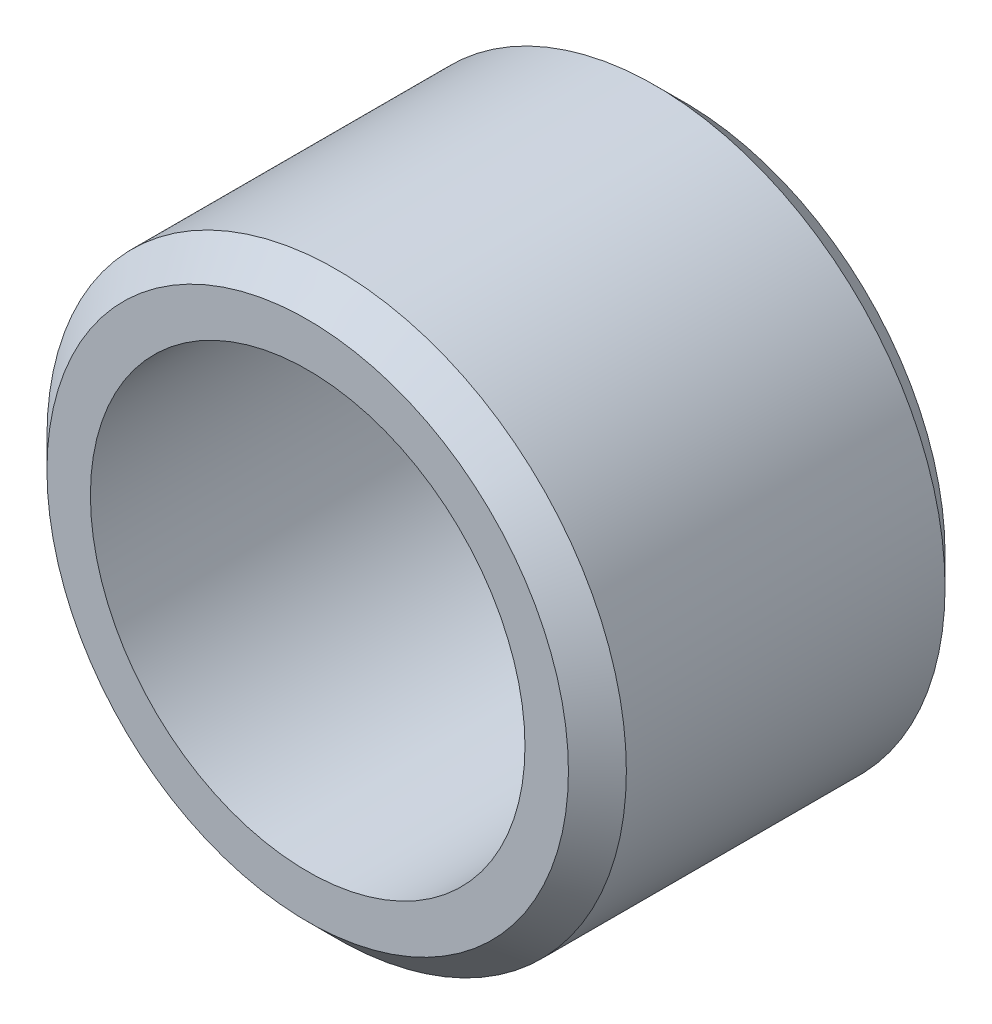
ISO-10303-21;
HEADER;
FILE_DESCRIPTION(('STEP AP214'),'2;1');
FILE_NAME('part.step','',(''),(''),'','','');
FILE_SCHEMA(('AUTOMOTIVE_DESIGN { 1 0 10303 214 1 1 1 1 }'));
ENDSEC;
DATA;
#1=APPLICATION_CONTEXT('core data for automotive mechanical design processes');
#2=APPLICATION_PROTOCOL_DEFINITION('international standard','automotive_design',2000,#1);
#3=PRODUCT_CONTEXT('',#1,'mechanical');
#4=PRODUCT('Part','Part','',(#3));
#5=PRODUCT_RELATED_PRODUCT_CATEGORY('part','',(#4));
#6=PRODUCT_DEFINITION_FORMATION('','',#4);
#7=PRODUCT_DEFINITION_CONTEXT('part definition',#1,'design');
#8=PRODUCT_DEFINITION('design','',#6,#7);
#9=PRODUCT_DEFINITION_SHAPE('','',#8);
#10=(LENGTH_UNIT() NAMED_UNIT(*) SI_UNIT(.MILLI.,.METRE.));
#11=(NAMED_UNIT(*) PLANE_ANGLE_UNIT() SI_UNIT($,.RADIAN.));
#12=(NAMED_UNIT(*) SI_UNIT($,.STERADIAN.) SOLID_ANGLE_UNIT());
#13=UNCERTAINTY_MEASURE_WITH_UNIT(LENGTH_MEASURE(1.E-05),#10,'distance_accuracy_value','');
#14=(GEOMETRIC_REPRESENTATION_CONTEXT(3) GLOBAL_UNCERTAINTY_ASSIGNED_CONTEXT((#13)) GLOBAL_UNIT_ASSIGNED_CONTEXT((#10,
#11,#12)) REPRESENTATION_CONTEXT('',''));
#15=CARTESIAN_POINT('',(0.,0.,0.));
#16=DIRECTION('',(0.,0.,1.));
#17=DIRECTION('',(1.,0.,0.));
#18=AXIS2_PLACEMENT_3D('',#15,#16,#17);
#19=CARTESIAN_POINT('',(0.,0.,6.5));
#20=DIRECTION('',(0.,0.,1.));
#21=DIRECTION('',(1.,0.,0.));
#22=AXIS2_PLACEMENT_3D('',#19,#20,#21);
#23=PLANE('',#22);
#24=CARTESIAN_POINT('',(0.,0.,6.5));
#25=DIRECTION('',(0.,0.,1.));
#26=DIRECTION('',(1.,0.,0.));
#27=AXIS2_PLACEMENT_3D('',#24,#25,#26);
#28=CIRCLE('',#27,9.00000000000002);
#29=CARTESIAN_POINT('',(9.00000000000002,0.,6.5));
#30=VERTEX_POINT('',#29);
#31=EDGE_CURVE('E10',#30,#30,#28,.T.);
#32=ORIENTED_EDGE('',*,*,#31,.T.);
#33=EDGE_LOOP('',(#32));
#34=FACE_BOUND('',#33,.T.);
#35=CARTESIAN_POINT('',(0.,0.,6.5));
#36=DIRECTION('',(0.,0.,1.));
#37=DIRECTION('',(1.,0.,0.));
#38=AXIS2_PLACEMENT_3D('',#35,#36,#37);
#39=CIRCLE('',#38,7.5);
#40=CARTESIAN_POINT('',(-7.5,0.,6.5));
#41=VERTEX_POINT('',#40);
#42=EDGE_CURVE('E58',#41,#41,#39,.T.);
#43=ORIENTED_EDGE('',*,*,#42,.F.);
#44=EDGE_LOOP('',(#43));
#45=FACE_BOUND('',#44,.T.);
#46=ADVANCED_FACE('F37',(#34,#45),#23,.T.);
#47=CARTESIAN_POINT('',(0.,0.,-6.5));
#48=DIRECTION('',(0.,0.,1.));
#49=DIRECTION('',(1.,0.,0.));
#50=AXIS2_PLACEMENT_3D('',#47,#48,#49);
#51=PLANE('',#50);
#52=CARTESIAN_POINT('',(0.,0.,-6.5));
#53=DIRECTION('',(0.,0.,1.));
#54=DIRECTION('',(1.,0.,0.));
#55=AXIS2_PLACEMENT_3D('',#52,#53,#54);
#56=CIRCLE('',#55,8.99999999999999);
#57=CARTESIAN_POINT('',(8.99999999999999,0.,-6.5));
#58=VERTEX_POINT('',#57);
#59=EDGE_CURVE('E45',#58,#58,#56,.F.);
#60=ORIENTED_EDGE('',*,*,#59,.T.);
#61=EDGE_LOOP('',(#60));
#62=FACE_BOUND('',#61,.T.);
#63=CARTESIAN_POINT('',(0.,0.,-6.5));
#64=DIRECTION('',(0.,0.,1.));
#65=DIRECTION('',(1.,0.,0.));
#66=AXIS2_PLACEMENT_3D('',#63,#64,#65);
#67=CIRCLE('',#66,7.5);
#68=CARTESIAN_POINT('',(-7.5,0.,-6.5));
#69=VERTEX_POINT('',#68);
#70=EDGE_CURVE('E59',#69,#69,#67,.T.);
#71=ORIENTED_EDGE('',*,*,#70,.T.);
#72=EDGE_LOOP('',(#71));
#73=FACE_BOUND('',#72,.T.);
#74=ADVANCED_FACE('F69',(#62,#73),#51,.F.);
#75=CARTESIAN_POINT('',(0.,0.,6.5));
#76=DIRECTION('',(0.,0.,-1.));
#77=DIRECTION('',(-1.,0.,0.));
#78=AXIS2_PLACEMENT_3D('',#75,#76,#77);
#79=CYLINDRICAL_SURFACE('',#78,10.);
#80=CARTESIAN_POINT('',(0.,0.,-5.49999999999999));
#81=DIRECTION('',(0.,0.,1.));
#82=DIRECTION('',(1.,0.,0.));
#83=AXIS2_PLACEMENT_3D('',#80,#81,#82);
#84=CIRCLE('',#83,10.);
#85=CARTESIAN_POINT('',(-10.,0.,-5.49999999999999));
#86=VERTEX_POINT('',#85);
#87=EDGE_CURVE('E49',#86,#86,#84,.T.);
#88=CARTESIAN_POINT('',(0.,0.,5.50000000000002));
#89=DIRECTION('',(0.,0.,1.));
#90=DIRECTION('',(1.,0.,0.));
#91=AXIS2_PLACEMENT_3D('',#88,#89,#90);
#92=CIRCLE('',#91,10.);
#93=CARTESIAN_POINT('',(-10.,0.,5.50000000000002));
#94=VERTEX_POINT('',#93);
#95=EDGE_CURVE('E53',#94,#94,#92,.F.);
#96=CARTESIAN_POINT('',(-10.,0.,-5.49999999999999));
#97=CARTESIAN_POINT('',(-10.,0.,-5.38541666666666));
#98=CARTESIAN_POINT('',(-10.,0.,-5.27083333333333));
#99=CARTESIAN_POINT('',(-10.,0.,-5.04166666666666));
#100=CARTESIAN_POINT('',(-10.,0.,-4.92708333333333));
#101=CARTESIAN_POINT('',(-10.,0.,-4.69791666666666));
#102=CARTESIAN_POINT('',(-10.,0.,-4.58333333333333));
#103=CARTESIAN_POINT('',(-10.,0.,-4.35416666666666));
#104=CARTESIAN_POINT('',(-10.,0.,-4.23958333333332));
#105=CARTESIAN_POINT('',(-10.,0.,-4.01041666666666));
#106=CARTESIAN_POINT('',(-10.,0.,-3.89583333333332));
#107=CARTESIAN_POINT('',(-10.,0.,-3.66666666666666));
#108=CARTESIAN_POINT('',(-10.,0.,-3.55208333333332));
#109=CARTESIAN_POINT('',(-10.,0.,-3.32291666666666));
#110=CARTESIAN_POINT('',(-10.,0.,-3.20833333333332));
#111=CARTESIAN_POINT('',(-10.,0.,-2.97916666666666));
#112=CARTESIAN_POINT('',(-10.,0.,-2.86458333333332));
#113=CARTESIAN_POINT('',(-10.,0.,-2.63541666666666));
#114=CARTESIAN_POINT('',(-10.,0.,-2.52083333333332));
#115=CARTESIAN_POINT('',(-10.,0.,-2.29166666666666));
#116=CARTESIAN_POINT('',(-10.,0.,-2.17708333333332));
#117=CARTESIAN_POINT('',(-10.,0.,-1.94791666666666));
#118=CARTESIAN_POINT('',(-10.,0.,-1.83333333333332));
#119=CARTESIAN_POINT('',(-10.,0.,-1.60416666666665));
#120=CARTESIAN_POINT('',(-10.,0.,-1.48958333333332));
#121=CARTESIAN_POINT('',(-10.,0.,-1.26041666666665));
#122=CARTESIAN_POINT('',(-10.,0.,-1.14583333333332));
#123=CARTESIAN_POINT('',(-10.,0.,-0.916666666666655));
#124=CARTESIAN_POINT('',(-10.,0.,-0.802083333333321));
#125=CARTESIAN_POINT('',(-10.,0.,-0.572916666666654));
#126=CARTESIAN_POINT('',(-10.,0.,-0.458333333333321));
#127=CARTESIAN_POINT('',(-10.,0.,-0.229166666666654));
#128=CARTESIAN_POINT('',(-10.,0.,-0.11458333333332));
#129=CARTESIAN_POINT('',(-10.,0.,0.114583333333346));
#130=CARTESIAN_POINT('',(-10.,0.,0.22916666666668));
#131=CARTESIAN_POINT('',(-10.,0.,0.458333333333347));
#132=CARTESIAN_POINT('',(-10.,0.,0.57291666666668));
#133=CARTESIAN_POINT('',(-10.,0.,0.802083333333347));
#134=CARTESIAN_POINT('',(-10.,0.,0.916666666666681));
#135=CARTESIAN_POINT('',(-10.,0.,1.14583333333335));
#136=CARTESIAN_POINT('',(-10.,0.,1.26041666666668));
#137=CARTESIAN_POINT('',(-10.,0.,1.48958333333335));
#138=CARTESIAN_POINT('',(-10.,0.,1.60416666666668));
#139=CARTESIAN_POINT('',(-10.,0.,1.83333333333335));
#140=CARTESIAN_POINT('',(-10.,0.,1.94791666666668));
#141=CARTESIAN_POINT('',(-10.,0.,2.17708333333335));
#142=CARTESIAN_POINT('',(-10.,0.,2.29166666666668));
#143=CARTESIAN_POINT('',(-10.,0.,2.52083333333335));
#144=CARTESIAN_POINT('',(-10.,0.,2.63541666666668));
#145=CARTESIAN_POINT('',(-10.,0.,2.86458333333335));
#146=CARTESIAN_POINT('',(-10.,0.,2.97916666666668));
#147=CARTESIAN_POINT('',(-10.,0.,3.20833333333335));
#148=CARTESIAN_POINT('',(-10.,0.,3.32291666666668));
#149=CARTESIAN_POINT('',(-10.,0.,3.55208333333335));
#150=CARTESIAN_POINT('',(-10.,0.,3.66666666666668));
#151=CARTESIAN_POINT('',(-10.,0.,3.89583333333335));
#152=CARTESIAN_POINT('',(-10.,0.,4.01041666666668));
#153=CARTESIAN_POINT('',(-10.,0.,4.23958333333335));
#154=CARTESIAN_POINT('',(-10.,0.,4.35416666666668));
#155=CARTESIAN_POINT('',(-10.,0.,4.58333333333335));
#156=CARTESIAN_POINT('',(-10.,0.,4.69791666666668));
#157=CARTESIAN_POINT('',(-10.,0.,4.92708333333335));
#158=CARTESIAN_POINT('',(-10.,0.,5.04166666666668));
#159=CARTESIAN_POINT('',(-10.,0.,5.27083333333335));
#160=CARTESIAN_POINT('',(-10.,0.,5.38541666666668));
#161=CARTESIAN_POINT('',(-10.,0.,5.50000000000002));
#162=B_SPLINE_CURVE_WITH_KNOTS('',3,(#96,#97,#98,#99,#100,#101,#102,#103,#104,#105,#106,#107,
#108,#109,#110,#111,#112,#113,#114,#115,#116,#117,#118,#119,#120,#121,#122,#123,#124,#125,#126,
#127,#128,#129,#130,#131,#132,#133,#134,#135,#136,#137,#138,#139,#140,#141,#142,#143,#144,#145,
#146,#147,#148,#149,#150,#151,#152,#153,#154,#155,#156,#157,#158,#159,#160,#161),.UNSPECIFIED.,
.F.,.F.,(4,2,2,2,2,2,2,2,2,2,2,2,2,2,2,2,2,2,2,2,2,2,2,2,2,2,2,2,2,2,2,2,4),(0.,0.34375,
0.687500000000001,1.03125,1.375,1.71875,2.0625,2.40625,2.75,3.09375,3.4375,3.78125,4.125,
4.46875,4.8125,5.15625,5.50000000000001,5.84375000000001,6.18750000000001,6.53125000000001,
6.87500000000001,7.21875000000001,7.56250000000001,7.90625000000001,8.25000000000001,
8.59375000000001,8.93750000000001,9.28125000000001,9.62500000000001,9.96875000000001,10.3125,
10.65625,11.),.UNSPECIFIED.);
#163=EDGE_CURVE('BSEAM74',#86,#94,#162,.T.);
#164=ORIENTED_EDGE('',*,*,#87,.T.);
#165=ORIENTED_EDGE('',*,*,#95,.T.);
#166=ORIENTED_EDGE('',*,*,#163,.T.);
#167=ORIENTED_EDGE('',*,*,#163,.F.);
#168=EDGE_LOOP('',(#164,#166,#165,#167));
#169=FACE_BOUND('',#168,.T.);
#170=ADVANCED_FACE('F74',(#169),#79,.T.);
#171=CARTESIAN_POINT('',(0.,0.,6.5));
#172=DIRECTION('',(0.,0.,-1.));
#173=DIRECTION('',(-1.,0.,0.));
#174=AXIS2_PLACEMENT_3D('',#171,#172,#173);
#175=CYLINDRICAL_SURFACE('',#174,7.5);
#176=CARTESIAN_POINT('',(-7.5,0.,6.5));
#177=CARTESIAN_POINT('',(-7.5,0.,6.36458333333333));
#178=CARTESIAN_POINT('',(-7.5,0.,6.22916666666667));
#179=CARTESIAN_POINT('',(-7.5,0.,5.95833333333333));
#180=CARTESIAN_POINT('',(-7.5,0.,5.82291666666667));
#181=CARTESIAN_POINT('',(-7.5,0.,5.55208333333333));
#182=CARTESIAN_POINT('',(-7.5,0.,5.41666666666667));
#183=CARTESIAN_POINT('',(-7.5,0.,5.14583333333333));
#184=CARTESIAN_POINT('',(-7.5,0.,5.01041666666667));
#185=CARTESIAN_POINT('',(-7.5,0.,4.73958333333333));
#186=CARTESIAN_POINT('',(-7.5,0.,4.60416666666667));
#187=CARTESIAN_POINT('',(-7.5,0.,4.33333333333333));
#188=CARTESIAN_POINT('',(-7.5,0.,4.19791666666667));
#189=CARTESIAN_POINT('',(-7.5,0.,3.92708333333333));
#190=CARTESIAN_POINT('',(-7.5,0.,3.79166666666667));
#191=CARTESIAN_POINT('',(-7.5,0.,3.52083333333333));
#192=CARTESIAN_POINT('',(-7.5,0.,3.38541666666667));
#193=CARTESIAN_POINT('',(-7.5,0.,3.11458333333333));
#194=CARTESIAN_POINT('',(-7.5,0.,2.97916666666667));
#195=CARTESIAN_POINT('',(-7.5,0.,2.70833333333333));
#196=CARTESIAN_POINT('',(-7.5,0.,2.57291666666667));
#197=CARTESIAN_POINT('',(-7.5,0.,2.30208333333333));
#198=CARTESIAN_POINT('',(-7.5,0.,2.16666666666667));
#199=CARTESIAN_POINT('',(-7.5,0.,1.89583333333333));
#200=CARTESIAN_POINT('',(-7.5,0.,1.76041666666667));
#201=CARTESIAN_POINT('',(-7.5,0.,1.48958333333333));
#202=CARTESIAN_POINT('',(-7.5,0.,1.35416666666667));
#203=CARTESIAN_POINT('',(-7.5,0.,1.08333333333333));
#204=CARTESIAN_POINT('',(-7.5,0.,0.947916666666667));
#205=CARTESIAN_POINT('',(-7.5,0.,0.677083333333333));
#206=CARTESIAN_POINT('',(-7.5,0.,0.541666666666667));
#207=CARTESIAN_POINT('',(-7.5,0.,0.270833333333334));
#208=CARTESIAN_POINT('',(-7.5,0.,0.135416666666667));
#209=CARTESIAN_POINT('',(-7.5,0.,-0.135416666666667));
#210=CARTESIAN_POINT('',(-7.5,0.,-0.270833333333334));
#211=CARTESIAN_POINT('',(-7.5,0.,-0.541666666666667));
#212=CARTESIAN_POINT('',(-7.5,0.,-0.677083333333333));
#213=CARTESIAN_POINT('',(-7.5,0.,-0.947916666666667));
#214=CARTESIAN_POINT('',(-7.5,0.,-1.08333333333333));
#215=CARTESIAN_POINT('',(-7.5,0.,-1.35416666666667));
#216=CARTESIAN_POINT('',(-7.5,0.,-1.48958333333333));
#217=CARTESIAN_POINT('',(-7.5,0.,-1.76041666666667));
#218=CARTESIAN_POINT('',(-7.5,0.,-1.89583333333333));
#219=CARTESIAN_POINT('',(-7.5,0.,-2.16666666666667));
#220=CARTESIAN_POINT('',(-7.5,0.,-2.30208333333333));
#221=CARTESIAN_POINT('',(-7.5,0.,-2.57291666666667));
#222=CARTESIAN_POINT('',(-7.5,0.,-2.70833333333333));
#223=CARTESIAN_POINT('',(-7.5,0.,-2.97916666666667));
#224=CARTESIAN_POINT('',(-7.5,0.,-3.11458333333333));
#225=CARTESIAN_POINT('',(-7.5,0.,-3.38541666666667));
#226=CARTESIAN_POINT('',(-7.5,0.,-3.52083333333333));
#227=CARTESIAN_POINT('',(-7.5,0.,-3.79166666666667));
#228=CARTESIAN_POINT('',(-7.5,0.,-3.92708333333333));
#229=CARTESIAN_POINT('',(-7.5,0.,-4.19791666666667));
#230=CARTESIAN_POINT('',(-7.5,0.,-4.33333333333333));
#231=CARTESIAN_POINT('',(-7.5,0.,-4.60416666666667));
#232=CARTESIAN_POINT('',(-7.5,0.,-4.73958333333333));
#233=CARTESIAN_POINT('',(-7.5,0.,-5.01041666666667));
#234=CARTESIAN_POINT('',(-7.5,0.,-5.14583333333333));
#235=CARTESIAN_POINT('',(-7.5,0.,-5.41666666666667));
#236=CARTESIAN_POINT('',(-7.5,0.,-5.55208333333333));
#237=CARTESIAN_POINT('',(-7.5,0.,-5.82291666666667));
#238=CARTESIAN_POINT('',(-7.5,0.,-5.95833333333333));
#239=CARTESIAN_POINT('',(-7.5,0.,-6.22916666666667));
#240=CARTESIAN_POINT('',(-7.5,0.,-6.36458333333333));
#241=CARTESIAN_POINT('',(-7.5,0.,-6.5));
#242=B_SPLINE_CURVE_WITH_KNOTS('',3,(#176,#177,#178,#179,#180,#181,#182,#183,#184,#185,#186,
#187,#188,#189,#190,#191,#192,#193,#194,#195,#196,#197,#198,#199,#200,#201,#202,#203,#204,#205,
#206,#207,#208,#209,#210,#211,#212,#213,#214,#215,#216,#217,#218,#219,#220,#221,#222,#223,#224,
#225,#226,#227,#228,#229,#230,#231,#232,#233,#234,#235,#236,#237,#238,#239,#240,#241),
.UNSPECIFIED.,.F.,.F.,(4,2,2,2,2,2,2,2,2,2,2,2,2,2,2,2,2,2,2,2,2,2,2,2,2,2,2,2,2,2,2,2,4),(0.,
0.40625,0.812500000000001,1.21875,1.625,2.03125,2.4375,2.84375,3.25,3.65625,4.0625,4.46875,
4.875,5.28125,5.6875,6.09375,6.5,6.90625,7.3125,7.71875,8.125,8.53125,8.9375,9.34375,9.75,
10.15625,10.5625,10.96875,11.375,11.78125,12.1875,12.59375,13.),.UNSPECIFIED.);
#243=EDGE_CURVE('BSEAM65',#41,#69,#242,.T.);
#244=ORIENTED_EDGE('',*,*,#42,.T.);
#245=ORIENTED_EDGE('',*,*,#70,.F.);
#246=ORIENTED_EDGE('',*,*,#243,.T.);
#247=ORIENTED_EDGE('',*,*,#243,.F.);
#248=EDGE_LOOP('',(#244,#246,#245,#247));
#249=FACE_BOUND('',#248,.T.);
#250=ADVANCED_FACE('F65',(#249),#175,.F.);
#251=CARTESIAN_POINT('',(0.,0.,-5.49999999999999));
#252=DIRECTION('',(0.,0.,1.));
#253=DIRECTION('',(1.,0.,0.));
#254=AXIS2_PLACEMENT_3D('',#251,#252,#253);
#255=CONICAL_SURFACE('',#254,10.,0.78539816339745);
#256=ORIENTED_EDGE('',*,*,#59,.F.);
#257=EDGE_LOOP('',(#256));
#258=FACE_BOUND('',#257,.T.);
#259=ORIENTED_EDGE('',*,*,#87,.F.);
#260=EDGE_LOOP('',(#259));
#261=FACE_BOUND('',#260,.T.);
#262=ADVANCED_FACE('F81',(#258,#261),#255,.T.);
#263=CARTESIAN_POINT('',(0.,0.,6.5));
#264=DIRECTION('',(0.,0.,-1.));
#265=DIRECTION('',(-1.,0.,0.));
#266=AXIS2_PLACEMENT_3D('',#263,#264,#265);
#267=CONICAL_SURFACE('',#266,9.00000000000002,0.785398163397447);
#268=ORIENTED_EDGE('',*,*,#95,.F.);
#269=EDGE_LOOP('',(#268));
#270=FACE_BOUND('',#269,.T.);
#271=ORIENTED_EDGE('',*,*,#31,.F.);
#272=EDGE_LOOP('',(#271));
#273=FACE_BOUND('',#272,.T.);
#274=ADVANCED_FACE('F40',(#270,#273),#267,.T.);
#275=CLOSED_SHELL('',(#46,#74,#170,#250,#262,#274));
#276=MANIFOLD_SOLID_BREP('B2',#275);
#277=ADVANCED_BREP_SHAPE_REPRESENTATION('',(#18,#276),#14);
#278=SHAPE_DEFINITION_REPRESENTATION(#9,#277);
ENDSEC;
END-ISO-10303-21;
